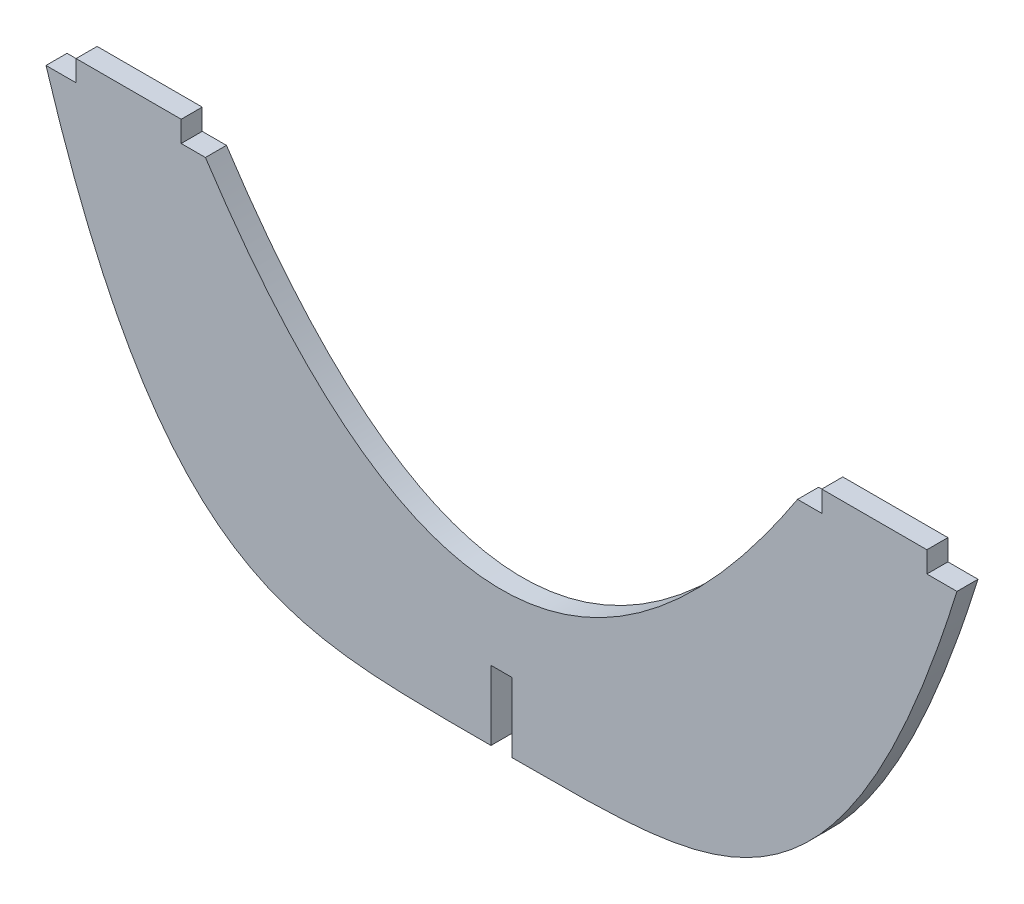
ISO-10303-21;
HEADER;
FILE_DESCRIPTION(('STEP AP214'),'2;1');
FILE_NAME('part.step','',(''),(''),'','','');
FILE_SCHEMA(('AUTOMOTIVE_DESIGN { 1 0 10303 214 1 1 1 1 }'));
ENDSEC;
DATA;
#1=APPLICATION_CONTEXT('core data for automotive mechanical design processes');
#2=APPLICATION_PROTOCOL_DEFINITION('international standard','automotive_design',2000,#1);
#3=PRODUCT_CONTEXT('',#1,'mechanical');
#4=PRODUCT('Part','Part','',(#3));
#5=PRODUCT_RELATED_PRODUCT_CATEGORY('part','',(#4));
#6=PRODUCT_DEFINITION_FORMATION('','',#4);
#7=PRODUCT_DEFINITION_CONTEXT('part definition',#1,'design');
#8=PRODUCT_DEFINITION('design','',#6,#7);
#9=PRODUCT_DEFINITION_SHAPE('','',#8);
#10=(LENGTH_UNIT() NAMED_UNIT(*) SI_UNIT(.MILLI.,.METRE.));
#11=(NAMED_UNIT(*) PLANE_ANGLE_UNIT() SI_UNIT($,.RADIAN.));
#12=(NAMED_UNIT(*) SI_UNIT($,.STERADIAN.) SOLID_ANGLE_UNIT());
#13=UNCERTAINTY_MEASURE_WITH_UNIT(LENGTH_MEASURE(1.E-05),#10,'distance_accuracy_value','');
#14=(GEOMETRIC_REPRESENTATION_CONTEXT(3) GLOBAL_UNCERTAINTY_ASSIGNED_CONTEXT((#13)) GLOBAL_UNIT_ASSIGNED_CONTEXT((#10,
#11,#12)) REPRESENTATION_CONTEXT('',''));
#15=CARTESIAN_POINT('',(0.,0.,0.));
#16=DIRECTION('',(0.,0.,1.));
#17=DIRECTION('',(1.,0.,0.));
#18=AXIS2_PLACEMENT_3D('',#15,#16,#17);
#19=CARTESIAN_POINT('',(-64.9999999855477,52.2967528831762,3.));
#20=CARTESIAN_POINT('',(-32.4999999905904,-52.2967528845253,3.));
#21=CARTESIAN_POINT('',(-6.03423561118532E-12,52.2967528831566,3.));
#22=CARTESIAN_POINT('',(32.4999999949512,-52.2967528817882,3.));
#23=CARTESIAN_POINT('',(64.9999999855355,52.296752883137,3.));
#24=B_SPLINE_CURVE_WITH_KNOTS('',4,(#19,#20,#21,#22,#23),.UNSPECIFIED.,.F.,.F.,(5,5),
(0.0356801171399617,0.964319882853919),.UNSPECIFIED.);
#25=DIRECTION('',(0.,0.,-1.));
#26=VECTOR('',#25,1.);
#27=SURFACE_OF_LINEAR_EXTRUSION('',#24,#26);
#28=CARTESIAN_POINT('',(1.5,1.48315742080239E-05,3.));
#29=VERTEX_POINT('',#28);
#30=CARTESIAN_POINT('',(64.9999999856793,52.2967528835998,3.));
#31=VERTEX_POINT('',#30);
#32=EDGE_CURVE('E198',#29,#31,#24,.T.);
#33=ORIENTED_EDGE('',*,*,#32,.F.);
#34=DIRECTION('',(0.,0.,-1.));
#35=VECTOR('',#34,1.);
#36=CARTESIAN_POINT('',(1.49999999999999,1.48315742079684E-05,3.));
#37=LINE('',#36,#35);
#38=CARTESIAN_POINT('',(1.5,1.4831574208024E-05,0.));
#39=VERTEX_POINT('',#38);
#40=EDGE_CURVE('E179',#29,#39,#37,.T.);
#41=ORIENTED_EDGE('',*,*,#40,.T.);
#42=CARTESIAN_POINT('',(-64.9999999855477,52.2967528831762,0.));
#43=CARTESIAN_POINT('',(-32.4999999905904,-52.2967528845253,0.));
#44=CARTESIAN_POINT('',(-6.03423561118532E-12,52.2967528831566,0.));
#45=CARTESIAN_POINT('',(32.4999999949512,-52.2967528817882,0.));
#46=CARTESIAN_POINT('',(64.9999999855355,52.296752883137,0.));
#47=B_SPLINE_CURVE_WITH_KNOTS('',4,(#42,#43,#44,#45,#46),.UNSPECIFIED.,.F.,.F.,(5,5),
(0.0356801171399617,0.964319882853919),.UNSPECIFIED.);
#48=CARTESIAN_POINT('',(64.9999999856793,52.2967528835998,0.));
#49=VERTEX_POINT('',#48);
#50=EDGE_CURVE('E190',#39,#49,#47,.T.);
#51=ORIENTED_EDGE('',*,*,#50,.T.);
#52=DIRECTION('',(0.,0.,-1.));
#53=VECTOR('',#52,1.);
#54=CARTESIAN_POINT('',(64.9999999856793,52.2967528835998,3.));
#55=LINE('',#54,#53);
#56=EDGE_CURVE('E265',#31,#49,#55,.T.);
#57=ORIENTED_EDGE('',*,*,#56,.F.);
#58=EDGE_LOOP('',(#33,#41,#51,#57));
#59=FACE_BOUND('',#58,.T.);
#60=ADVANCED_FACE('F45',(#59),#27,.F.);
#61=CARTESIAN_POINT('',(-64.9999999856793,52.2967528835998,0.));
#62=VERTEX_POINT('',#61);
#63=CARTESIAN_POINT('',(-1.50000000000001,1.48315116167783E-05,0.));
#64=VERTEX_POINT('',#63);
#65=EDGE_CURVE('E361',#62,#64,#47,.T.);
#66=ORIENTED_EDGE('',*,*,#65,.T.);
#67=DIRECTION('',(0.,0.,-1.));
#68=VECTOR('',#67,1.);
#69=CARTESIAN_POINT('',(-1.49999999999879,1.48315116175679E-05,3.));
#70=LINE('',#69,#68);
#71=CARTESIAN_POINT('',(-1.50000000000002,1.48315116167783E-05,3.));
#72=VERTEX_POINT('',#71);
#73=EDGE_CURVE('E181',#64,#72,#70,.F.);
#74=ORIENTED_EDGE('',*,*,#73,.T.);
#75=CARTESIAN_POINT('',(-64.9999999856793,52.2967528835998,3.));
#76=VERTEX_POINT('',#75);
#77=EDGE_CURVE('E191',#76,#72,#24,.T.);
#78=ORIENTED_EDGE('',*,*,#77,.F.);
#79=DIRECTION('',(0.,0.,-1.));
#80=VECTOR('',#79,1.);
#81=CARTESIAN_POINT('',(-64.9999999856793,52.2967528835998,3.));
#82=LINE('',#81,#80);
#83=EDGE_CURVE('E280',#76,#62,#82,.T.);
#84=ORIENTED_EDGE('',*,*,#83,.T.);
#85=EDGE_LOOP('',(#66,#74,#78,#84));
#86=FACE_BOUND('',#85,.T.);
#87=ADVANCED_FACE('F47',(#86),#27,.F.);
#88=CARTESIAN_POINT('',(0.,52.2967528835998,3.));
#89=DIRECTION('',(0.,-1.,0.));
#90=DIRECTION('',(0.,0.,-1.));
#91=AXIS2_PLACEMENT_3D('',#88,#89,#90);
#92=PLANE('',#91);
#93=DIRECTION('',(-1.,0.,0.));
#94=VECTOR('',#93,1.);
#95=CARTESIAN_POINT('',(0.,52.2967528835998,0.));
#96=LINE('',#95,#94);
#97=CARTESIAN_POINT('',(60.7051969578082,52.2967528835998,0.));
#98=VERTEX_POINT('',#97);
#99=EDGE_CURVE('E547',#49,#98,#96,.T.);
#100=ORIENTED_EDGE('',*,*,#99,.T.);
#101=DIRECTION('',(0.,0.,-1.));
#102=VECTOR('',#101,1.);
#103=CARTESIAN_POINT('',(60.7051969578082,52.2967528835998,3.));
#104=LINE('',#103,#102);
#105=CARTESIAN_POINT('',(60.7051969578082,52.2967528835998,3.));
#106=VERTEX_POINT('',#105);
#107=EDGE_CURVE('E314',#106,#98,#104,.T.);
#108=ORIENTED_EDGE('',*,*,#107,.F.);
#109=DIRECTION('',(-1.,0.,0.));
#110=VECTOR('',#109,1.);
#111=CARTESIAN_POINT('',(0.,52.2967528835998,3.));
#112=LINE('',#111,#110);
#113=EDGE_CURVE('E197',#31,#106,#112,.T.);
#114=ORIENTED_EDGE('',*,*,#113,.F.);
#115=ORIENTED_EDGE('',*,*,#56,.T.);
#116=EDGE_LOOP('',(#100,#108,#114,#115));
#117=FACE_BOUND('',#116,.T.);
#118=ADVANCED_FACE('F250',(#117),#92,.F.);
#119=CARTESIAN_POINT('',(60.7051969578082,0.,3.));
#120=DIRECTION('',(-1.,0.,0.));
#121=DIRECTION('',(0.,0.,1.));
#122=AXIS2_PLACEMENT_3D('',#119,#120,#121);
#123=PLANE('',#122);
#124=DIRECTION('',(0.,1.,0.));
#125=VECTOR('',#124,1.);
#126=CARTESIAN_POINT('',(60.7051969578082,0.,0.));
#127=LINE('',#126,#125);
#128=CARTESIAN_POINT('',(60.7051969578082,55.2967502711144,0.));
#129=VERTEX_POINT('',#128);
#130=EDGE_CURVE('E559',#98,#129,#127,.T.);
#131=ORIENTED_EDGE('',*,*,#130,.T.);
#132=DIRECTION('',(0.,0.,-1.));
#133=VECTOR('',#132,1.);
#134=CARTESIAN_POINT('',(60.7051969578082,55.2967502711144,3.));
#135=LINE('',#134,#133);
#136=CARTESIAN_POINT('',(60.7051969578082,55.2967502711144,3.));
#137=VERTEX_POINT('',#136);
#138=EDGE_CURVE('E310',#137,#129,#135,.T.);
#139=ORIENTED_EDGE('',*,*,#138,.F.);
#140=DIRECTION('',(0.,1.,0.));
#141=VECTOR('',#140,1.);
#142=CARTESIAN_POINT('',(60.7051969578082,0.,3.));
#143=LINE('',#142,#141);
#144=EDGE_CURVE('E204',#106,#137,#143,.T.);
#145=ORIENTED_EDGE('',*,*,#144,.F.);
#146=ORIENTED_EDGE('',*,*,#107,.T.);
#147=EDGE_LOOP('',(#131,#139,#145,#146));
#148=FACE_BOUND('',#147,.T.);
#149=ADVANCED_FACE('F247',(#148),#123,.F.);
#150=CARTESIAN_POINT('',(0.,55.2967502711144,3.));
#151=DIRECTION('',(0.,-1.,0.));
#152=DIRECTION('',(0.,0.,-1.));
#153=AXIS2_PLACEMENT_3D('',#150,#151,#152);
#154=PLANE('',#153);
#155=DIRECTION('',(-1.,0.,0.));
#156=VECTOR('',#155,1.);
#157=CARTESIAN_POINT('',(0.,55.2967502711144,0.));
#158=LINE('',#157,#156);
#159=CARTESIAN_POINT('',(45.7051969578082,55.2967502711144,0.));
#160=VERTEX_POINT('',#159);
#161=EDGE_CURVE('E562',#129,#160,#158,.T.);
#162=ORIENTED_EDGE('',*,*,#161,.T.);
#163=DIRECTION('',(0.,0.,-1.));
#164=VECTOR('',#163,1.);
#165=CARTESIAN_POINT('',(45.7051969578082,55.2967502711144,3.));
#166=LINE('',#165,#164);
#167=CARTESIAN_POINT('',(45.7051969578082,55.2967502711144,3.));
#168=VERTEX_POINT('',#167);
#169=EDGE_CURVE('E306',#168,#160,#166,.T.);
#170=ORIENTED_EDGE('',*,*,#169,.F.);
#171=DIRECTION('',(-1.,0.,0.));
#172=VECTOR('',#171,1.);
#173=CARTESIAN_POINT('',(0.,55.2967502711144,3.));
#174=LINE('',#173,#172);
#175=EDGE_CURVE('E207',#137,#168,#174,.T.);
#176=ORIENTED_EDGE('',*,*,#175,.F.);
#177=ORIENTED_EDGE('',*,*,#138,.T.);
#178=EDGE_LOOP('',(#162,#170,#176,#177));
#179=FACE_BOUND('',#178,.T.);
#180=ADVANCED_FACE('F243',(#179),#154,.F.);
#181=CARTESIAN_POINT('',(45.7051969578082,0.,3.));
#182=DIRECTION('',(1.,0.,0.));
#183=DIRECTION('',(0.,0.,-1.));
#184=AXIS2_PLACEMENT_3D('',#181,#182,#183);
#185=PLANE('',#184);
#186=DIRECTION('',(0.,-1.,0.));
#187=VECTOR('',#186,1.);
#188=CARTESIAN_POINT('',(45.7051969578082,0.,0.));
#189=LINE('',#188,#187);
#190=CARTESIAN_POINT('',(45.7051969578082,52.2967529286761,0.));
#191=VERTEX_POINT('',#190);
#192=EDGE_CURVE('E565',#160,#191,#189,.T.);
#193=ORIENTED_EDGE('',*,*,#192,.T.);
#194=DIRECTION('',(0.,0.,-1.));
#195=VECTOR('',#194,1.);
#196=CARTESIAN_POINT('',(45.7051969578082,52.2967529286761,3.));
#197=LINE('',#196,#195);
#198=CARTESIAN_POINT('',(45.7051969578082,52.2967529286761,3.));
#199=VERTEX_POINT('',#198);
#200=EDGE_CURVE('E302',#199,#191,#197,.T.);
#201=ORIENTED_EDGE('',*,*,#200,.F.);
#202=DIRECTION('',(0.,-1.,0.));
#203=VECTOR('',#202,1.);
#204=CARTESIAN_POINT('',(45.7051969578082,0.,3.));
#205=LINE('',#204,#203);
#206=EDGE_CURVE('E210',#168,#199,#205,.T.);
#207=ORIENTED_EDGE('',*,*,#206,.F.);
#208=ORIENTED_EDGE('',*,*,#169,.T.);
#209=EDGE_LOOP('',(#193,#201,#207,#208));
#210=FACE_BOUND('',#209,.T.);
#211=ADVANCED_FACE('F239',(#210),#185,.F.);
#212=CARTESIAN_POINT('',(0.,52.2967529286761,3.));
#213=DIRECTION('',(0.,-1.,0.));
#214=DIRECTION('',(0.,0.,-1.));
#215=AXIS2_PLACEMENT_3D('',#212,#213,#214);
#216=PLANE('',#215);
#217=DIRECTION('',(-1.,0.,0.));
#218=VECTOR('',#217,1.);
#219=CARTESIAN_POINT('',(0.,52.2967529286761,0.));
#220=LINE('',#219,#218);
#221=CARTESIAN_POINT('',(42.2495287390916,52.2967529286761,0.));
#222=VERTEX_POINT('',#221);
#223=EDGE_CURVE('E568',#191,#222,#220,.T.);
#224=ORIENTED_EDGE('',*,*,#223,.T.);
#225=DIRECTION('',(0.,0.,-1.));
#226=VECTOR('',#225,1.);
#227=CARTESIAN_POINT('',(42.2495287390916,52.2967529286761,3.));
#228=LINE('',#227,#226);
#229=CARTESIAN_POINT('',(42.2495287390916,52.2967529286761,3.));
#230=VERTEX_POINT('',#229);
#231=EDGE_CURVE('E299',#230,#222,#228,.T.);
#232=ORIENTED_EDGE('',*,*,#231,.F.);
#233=DIRECTION('',(-1.,0.,0.));
#234=VECTOR('',#233,1.);
#235=CARTESIAN_POINT('',(0.,52.2967529286761,3.));
#236=LINE('',#235,#234);
#237=EDGE_CURVE('E213',#199,#230,#236,.T.);
#238=ORIENTED_EDGE('',*,*,#237,.F.);
#239=ORIENTED_EDGE('',*,*,#200,.T.);
#240=EDGE_LOOP('',(#224,#232,#238,#239));
#241=FACE_BOUND('',#240,.T.);
#242=ADVANCED_FACE('F234',(#241),#216,.F.);
#243=CARTESIAN_POINT('',(-42.2495287390916,52.2967529286761,3.));
#244=CARTESIAN_POINT('',(0.,-12.2967529286761,3.));
#245=CARTESIAN_POINT('',(42.2495287390916,52.2967529286761,3.));
#246=B_SPLINE_CURVE_WITH_KNOTS('',2,(#243,#244,#245),.UNSPECIFIED.,.F.,.F.,(3,3),(0.,1.),.UNSPECIFIED.);
#247=DIRECTION('',(0.,0.,-1.));
#248=VECTOR('',#247,1.);
#249=SURFACE_OF_LINEAR_EXTRUSION('',#246,#248);
#250=CARTESIAN_POINT('',(-42.2495287390916,52.2967529286761,0.));
#251=CARTESIAN_POINT('',(0.,-12.2967529286761,0.));
#252=CARTESIAN_POINT('',(42.2495287390916,52.2967529286761,0.));
#253=B_SPLINE_CURVE_WITH_KNOTS('',2,(#250,#251,#252),.UNSPECIFIED.,.F.,.F.,(3,3),(0.,1.),.UNSPECIFIED.);
#254=CARTESIAN_POINT('',(-42.2495287390916,52.2967529286761,0.));
#255=VERTEX_POINT('',#254);
#256=EDGE_CURVE('E572',#255,#222,#253,.T.);
#257=ORIENTED_EDGE('',*,*,#256,.F.);
#258=DIRECTION('',(0.,0.,-1.));
#259=VECTOR('',#258,1.);
#260=CARTESIAN_POINT('',(-42.2495287390916,52.2967529286761,3.));
#261=LINE('',#260,#259);
#262=CARTESIAN_POINT('',(-42.2495287390916,52.2967529286761,3.));
#263=VERTEX_POINT('',#262);
#264=EDGE_CURVE('E296',#263,#255,#261,.T.);
#265=ORIENTED_EDGE('',*,*,#264,.F.);
#266=EDGE_CURVE('E216',#263,#230,#246,.T.);
#267=ORIENTED_EDGE('',*,*,#266,.T.);
#268=ORIENTED_EDGE('',*,*,#231,.T.);
#269=EDGE_LOOP('',(#257,#265,#267,#268));
#270=FACE_BOUND('',#269,.T.);
#271=ADVANCED_FACE('F229',(#270),#249,.T.);
#272=CARTESIAN_POINT('',(0.,52.2967529286761,3.));
#273=DIRECTION('',(0.,1.,0.));
#274=DIRECTION('',(0.,0.,1.));
#275=AXIS2_PLACEMENT_3D('',#272,#273,#274);
#276=PLANE('',#275);
#277=DIRECTION('',(1.,0.,0.));
#278=VECTOR('',#277,1.);
#279=CARTESIAN_POINT('',(0.,52.2967529286761,0.));
#280=LINE('',#279,#278);
#281=CARTESIAN_POINT('',(-45.7051969578082,52.2967529286761,0.));
#282=VERTEX_POINT('',#281);
#283=EDGE_CURVE('E578',#282,#255,#280,.T.);
#284=ORIENTED_EDGE('',*,*,#283,.F.);
#285=DIRECTION('',(0.,0.,-1.));
#286=VECTOR('',#285,1.);
#287=CARTESIAN_POINT('',(-45.7051969578082,52.2967529286761,3.));
#288=LINE('',#287,#286);
#289=CARTESIAN_POINT('',(-45.7051969578082,52.2967529286761,3.));
#290=VERTEX_POINT('',#289);
#291=EDGE_CURVE('E293',#290,#282,#288,.T.);
#292=ORIENTED_EDGE('',*,*,#291,.F.);
#293=DIRECTION('',(1.,0.,0.));
#294=VECTOR('',#293,1.);
#295=CARTESIAN_POINT('',(0.,52.2967529286761,3.));
#296=LINE('',#295,#294);
#297=EDGE_CURVE('E223',#290,#263,#296,.T.);
#298=ORIENTED_EDGE('',*,*,#297,.T.);
#299=ORIENTED_EDGE('',*,*,#264,.T.);
#300=EDGE_LOOP('',(#284,#292,#298,#299));
#301=FACE_BOUND('',#300,.T.);
#302=ADVANCED_FACE('F233',(#301),#276,.T.);
#303=CARTESIAN_POINT('',(-45.7051969578082,0.,3.));
#304=DIRECTION('',(1.,0.,0.));
#305=DIRECTION('',(0.,0.,-1.));
#306=AXIS2_PLACEMENT_3D('',#303,#304,#305);
#307=PLANE('',#306);
#308=DIRECTION('',(0.,-1.,0.));
#309=VECTOR('',#308,1.);
#310=CARTESIAN_POINT('',(-45.7051969578082,0.,0.));
#311=LINE('',#310,#309);
#312=CARTESIAN_POINT('',(-45.7051969578082,55.2967502711144,0.));
#313=VERTEX_POINT('',#312);
#314=EDGE_CURVE('E347',#313,#282,#311,.T.);
#315=ORIENTED_EDGE('',*,*,#314,.F.);
#316=DIRECTION('',(0.,0.,-1.));
#317=VECTOR('',#316,1.);
#318=CARTESIAN_POINT('',(-45.7051969578082,55.2967502711144,3.));
#319=LINE('',#318,#317);
#320=CARTESIAN_POINT('',(-45.7051969578082,55.2967502711144,3.));
#321=VERTEX_POINT('',#320);
#322=EDGE_CURVE('E290',#321,#313,#319,.T.);
#323=ORIENTED_EDGE('',*,*,#322,.F.);
#324=DIRECTION('',(0.,-1.,0.));
#325=VECTOR('',#324,1.);
#326=CARTESIAN_POINT('',(-45.7051969578082,0.,3.));
#327=LINE('',#326,#325);
#328=EDGE_CURVE('E331',#321,#290,#327,.T.);
#329=ORIENTED_EDGE('',*,*,#328,.T.);
#330=ORIENTED_EDGE('',*,*,#291,.T.);
#331=EDGE_LOOP('',(#315,#323,#329,#330));
#332=FACE_BOUND('',#331,.T.);
#333=ADVANCED_FACE('F345',(#332),#307,.T.);
#334=CARTESIAN_POINT('',(0.,55.2967502711144,3.));
#335=DIRECTION('',(0.,1.,0.));
#336=DIRECTION('',(0.,0.,1.));
#337=AXIS2_PLACEMENT_3D('',#334,#335,#336);
#338=PLANE('',#337);
#339=DIRECTION('',(1.,0.,0.));
#340=VECTOR('',#339,1.);
#341=CARTESIAN_POINT('',(0.,55.2967502711144,0.));
#342=LINE('',#341,#340);
#343=CARTESIAN_POINT('',(-60.7051969578082,55.2967502711144,0.));
#344=VERTEX_POINT('',#343);
#345=EDGE_CURVE('E276',#344,#313,#342,.T.);
#346=ORIENTED_EDGE('',*,*,#345,.F.);
#347=DIRECTION('',(0.,0.,-1.));
#348=VECTOR('',#347,1.);
#349=CARTESIAN_POINT('',(-60.7051969578082,55.2967502711144,3.));
#350=LINE('',#349,#348);
#351=CARTESIAN_POINT('',(-60.7051969578082,55.2967502711144,3.));
#352=VERTEX_POINT('',#351);
#353=EDGE_CURVE('E287',#352,#344,#350,.T.);
#354=ORIENTED_EDGE('',*,*,#353,.F.);
#355=DIRECTION('',(1.,0.,0.));
#356=VECTOR('',#355,1.);
#357=CARTESIAN_POINT('',(0.,55.2967502711144,3.));
#358=LINE('',#357,#356);
#359=EDGE_CURVE('E327',#352,#321,#358,.T.);
#360=ORIENTED_EDGE('',*,*,#359,.T.);
#361=ORIENTED_EDGE('',*,*,#322,.T.);
#362=EDGE_LOOP('',(#346,#354,#360,#361));
#363=FACE_BOUND('',#362,.T.);
#364=ADVANCED_FACE('F351',(#363),#338,.T.);
#365=CARTESIAN_POINT('',(-60.7051969578082,0.,3.));
#366=DIRECTION('',(-1.,0.,0.));
#367=DIRECTION('',(0.,0.,1.));
#368=AXIS2_PLACEMENT_3D('',#365,#366,#367);
#369=PLANE('',#368);
#370=DIRECTION('',(0.,1.,0.));
#371=VECTOR('',#370,1.);
#372=CARTESIAN_POINT('',(-60.7051969578082,0.,0.));
#373=LINE('',#372,#371);
#374=CARTESIAN_POINT('',(-60.7051969578082,52.2967528835998,0.));
#375=VERTEX_POINT('',#374);
#376=EDGE_CURVE('E271',#375,#344,#373,.T.);
#377=ORIENTED_EDGE('',*,*,#376,.F.);
#378=DIRECTION('',(0.,0.,-1.));
#379=VECTOR('',#378,1.);
#380=CARTESIAN_POINT('',(-60.7051969578082,52.2967528835998,3.));
#381=LINE('',#380,#379);
#382=CARTESIAN_POINT('',(-60.7051969578082,52.2967528835998,3.));
#383=VERTEX_POINT('',#382);
#384=EDGE_CURVE('E283',#383,#375,#381,.T.);
#385=ORIENTED_EDGE('',*,*,#384,.F.);
#386=DIRECTION('',(0.,1.,0.));
#387=VECTOR('',#386,1.);
#388=CARTESIAN_POINT('',(-60.7051969578082,0.,3.));
#389=LINE('',#388,#387);
#390=EDGE_CURVE('E323',#383,#352,#389,.T.);
#391=ORIENTED_EDGE('',*,*,#390,.T.);
#392=ORIENTED_EDGE('',*,*,#353,.T.);
#393=EDGE_LOOP('',(#377,#385,#391,#392));
#394=FACE_BOUND('',#393,.T.);
#395=ADVANCED_FACE('F356',(#394),#369,.T.);
#396=CARTESIAN_POINT('',(0.,52.2967528835998,3.));
#397=DIRECTION('',(0.,1.,0.));
#398=DIRECTION('',(0.,0.,1.));
#399=AXIS2_PLACEMENT_3D('',#396,#397,#398);
#400=PLANE('',#399);
#401=DIRECTION('',(1.,0.,0.));
#402=VECTOR('',#401,1.);
#403=CARTESIAN_POINT('',(0.,52.2967528835998,0.));
#404=LINE('',#403,#402);
#405=EDGE_CURVE('E268',#62,#375,#404,.T.);
#406=ORIENTED_EDGE('',*,*,#405,.F.);
#407=ORIENTED_EDGE('',*,*,#83,.F.);
#408=DIRECTION('',(1.,0.,0.));
#409=VECTOR('',#408,1.);
#410=CARTESIAN_POINT('',(0.,52.2967528835998,3.));
#411=LINE('',#410,#409);
#412=EDGE_CURVE('E284',#76,#383,#411,.T.);
#413=ORIENTED_EDGE('',*,*,#412,.T.);
#414=ORIENTED_EDGE('',*,*,#384,.T.);
#415=EDGE_LOOP('',(#406,#407,#413,#414));
#416=FACE_BOUND('',#415,.T.);
#417=ADVANCED_FACE('F358',(#416),#400,.T.);
#418=CARTESIAN_POINT('',(0.,0.,3.));
#419=DIRECTION('',(0.,0.,1.));
#420=DIRECTION('',(1.,0.,0.));
#421=AXIS2_PLACEMENT_3D('',#418,#419,#420);
#422=PLANE('',#421);
#423=DIRECTION('',(-1.,0.,0.));
#424=VECTOR('',#423,1.);
#425=CARTESIAN_POINT('',(-1.5,9.91,3.));
#426=LINE('',#425,#424);
#427=CARTESIAN_POINT('',(1.5,9.91,3.));
#428=VERTEX_POINT('',#427);
#429=CARTESIAN_POINT('',(-1.5,9.91,3.));
#430=VERTEX_POINT('',#429);
#431=EDGE_CURVE('E160',#428,#430,#426,.T.);
#432=ORIENTED_EDGE('',*,*,#431,.F.);
#433=DIRECTION('',(0.,1.,0.));
#434=VECTOR('',#433,1.);
#435=CARTESIAN_POINT('',(1.5,0.000504044169637261,3.));
#436=LINE('',#435,#434);
#437=EDGE_CURVE('E171',#29,#428,#436,.T.);
#438=ORIENTED_EDGE('',*,*,#437,.F.);
#439=ORIENTED_EDGE('',*,*,#32,.T.);
#440=ORIENTED_EDGE('',*,*,#113,.T.);
#441=ORIENTED_EDGE('',*,*,#144,.T.);
#442=ORIENTED_EDGE('',*,*,#175,.T.);
#443=ORIENTED_EDGE('',*,*,#206,.T.);
#444=ORIENTED_EDGE('',*,*,#237,.T.);
#445=ORIENTED_EDGE('',*,*,#266,.F.);
#446=ORIENTED_EDGE('',*,*,#297,.F.);
#447=ORIENTED_EDGE('',*,*,#328,.F.);
#448=ORIENTED_EDGE('',*,*,#359,.F.);
#449=ORIENTED_EDGE('',*,*,#390,.F.);
#450=ORIENTED_EDGE('',*,*,#412,.F.);
#451=ORIENTED_EDGE('',*,*,#77,.T.);
#452=DIRECTION('',(0.,-1.,0.));
#453=VECTOR('',#452,1.);
#454=CARTESIAN_POINT('',(-1.50000000000002,1.4831511704113E-05,3.));
#455=LINE('',#454,#453);
#456=EDGE_CURVE('E174',#430,#72,#455,.T.);
#457=ORIENTED_EDGE('',*,*,#456,.F.);
#458=EDGE_LOOP('',(#432,#438,#439,#440,#441,#442,#443,#444,#445,#446,#447,#448,#449,#450,#451,#457));
#459=FACE_BOUND('',#458,.T.);
#460=ADVANCED_FACE('F170',(#459),#422,.T.);
#461=CARTESIAN_POINT('',(0.,0.,0.));
#462=DIRECTION('',(0.,0.,1.));
#463=DIRECTION('',(1.,0.,0.));
#464=AXIS2_PLACEMENT_3D('',#461,#462,#463);
#465=PLANE('',#464);
#466=DIRECTION('',(0.,1.,0.));
#467=VECTOR('',#466,1.);
#468=CARTESIAN_POINT('',(1.5,0.,0.));
#469=LINE('',#468,#467);
#470=CARTESIAN_POINT('',(1.5,9.91,0.));
#471=VERTEX_POINT('',#470);
#472=EDGE_CURVE('E11',#39,#471,#469,.T.);
#473=ORIENTED_EDGE('',*,*,#472,.T.);
#474=DIRECTION('',(-1.,0.,0.));
#475=VECTOR('',#474,1.);
#476=CARTESIAN_POINT('',(-1.5,9.91,0.));
#477=LINE('',#476,#475);
#478=CARTESIAN_POINT('',(-1.50000000000009,9.91,0.));
#479=VERTEX_POINT('',#478);
#480=EDGE_CURVE('E61',#471,#479,#477,.T.);
#481=ORIENTED_EDGE('',*,*,#480,.T.);
#482=DIRECTION('',(0.,-1.,0.));
#483=VECTOR('',#482,1.);
#484=CARTESIAN_POINT('',(-1.50000000000002,0.,0.));
#485=LINE('',#484,#483);
#486=EDGE_CURVE('E55',#479,#64,#485,.T.);
#487=ORIENTED_EDGE('',*,*,#486,.T.);
#488=ORIENTED_EDGE('',*,*,#65,.F.);
#489=ORIENTED_EDGE('',*,*,#405,.T.);
#490=ORIENTED_EDGE('',*,*,#376,.T.);
#491=ORIENTED_EDGE('',*,*,#345,.T.);
#492=ORIENTED_EDGE('',*,*,#314,.T.);
#493=ORIENTED_EDGE('',*,*,#283,.T.);
#494=ORIENTED_EDGE('',*,*,#256,.T.);
#495=ORIENTED_EDGE('',*,*,#223,.F.);
#496=ORIENTED_EDGE('',*,*,#192,.F.);
#497=ORIENTED_EDGE('',*,*,#161,.F.);
#498=ORIENTED_EDGE('',*,*,#130,.F.);
#499=ORIENTED_EDGE('',*,*,#99,.F.);
#500=ORIENTED_EDGE('',*,*,#50,.F.);
#501=EDGE_LOOP('',(#473,#481,#487,#488,#489,#490,#491,#492,#493,#494,#495,#496,#497,#498,#499,#500));
#502=FACE_BOUND('',#501,.T.);
#503=ADVANCED_FACE('F375',(#502),#465,.F.);
#504=CARTESIAN_POINT('',(1.5,0.000504044169637261,-7.));
#505=DIRECTION('',(1.,0.,0.));
#506=DIRECTION('',(0.,1.,0.));
#507=AXIS2_PLACEMENT_3D('',#504,#505,#506);
#508=PLANE('',#507);
#509=ORIENTED_EDGE('',*,*,#437,.T.);
#510=DIRECTION('',(0.,0.,-1.));
#511=VECTOR('',#510,1.);
#512=CARTESIAN_POINT('',(1.5,9.91,3.));
#513=LINE('',#512,#511);
#514=EDGE_CURVE('E157',#428,#471,#513,.T.);
#515=ORIENTED_EDGE('',*,*,#514,.T.);
#516=ORIENTED_EDGE('',*,*,#472,.F.);
#517=ORIENTED_EDGE('',*,*,#40,.F.);
#518=EDGE_LOOP('',(#509,#515,#516,#517));
#519=FACE_BOUND('',#518,.T.);
#520=ADVANCED_FACE('F177',(#519),#508,.F.);
#521=CARTESIAN_POINT('',(-1.50000000000002,1.4831511704113E-05,-7.));
#522=DIRECTION('',(-1.,0.,0.));
#523=DIRECTION('',(0.,-1.,0.));
#524=AXIS2_PLACEMENT_3D('',#521,#522,#523);
#525=PLANE('',#524);
#526=ORIENTED_EDGE('',*,*,#486,.F.);
#527=DIRECTION('',(0.,0.,-1.));
#528=VECTOR('',#527,1.);
#529=CARTESIAN_POINT('',(-1.5,9.91,3.));
#530=LINE('',#529,#528);
#531=EDGE_CURVE('E165',#430,#479,#530,.T.);
#532=ORIENTED_EDGE('',*,*,#531,.F.);
#533=ORIENTED_EDGE('',*,*,#456,.T.);
#534=ORIENTED_EDGE('',*,*,#73,.F.);
#535=EDGE_LOOP('',(#526,#532,#533,#534));
#536=FACE_BOUND('',#535,.T.);
#537=ADVANCED_FACE('F363',(#536),#525,.F.);
#538=CARTESIAN_POINT('',(-1.5,9.91,3.));
#539=DIRECTION('',(0.,-1.,0.));
#540=DIRECTION('',(0.,0.,-1.));
#541=AXIS2_PLACEMENT_3D('',#538,#539,#540);
#542=PLANE('',#541);
#543=ORIENTED_EDGE('',*,*,#480,.F.);
#544=ORIENTED_EDGE('',*,*,#514,.F.);
#545=ORIENTED_EDGE('',*,*,#431,.T.);
#546=ORIENTED_EDGE('',*,*,#531,.T.);
#547=EDGE_LOOP('',(#543,#544,#545,#546));
#548=FACE_BOUND('',#547,.T.);
#549=ADVANCED_FACE('F159',(#548),#542,.T.);
#550=CLOSED_SHELL('',(#60,#87,#118,#149,#180,#211,#242,#271,#302,#333,#364,#395,#417,#460,#503,
#520,#537,#549));
#551=MANIFOLD_SOLID_BREP('B2',#550);
#552=ADVANCED_BREP_SHAPE_REPRESENTATION('',(#18,#551),#14);
#553=SHAPE_DEFINITION_REPRESENTATION(#9,#552);
ENDSEC;
END-ISO-10303-21;
